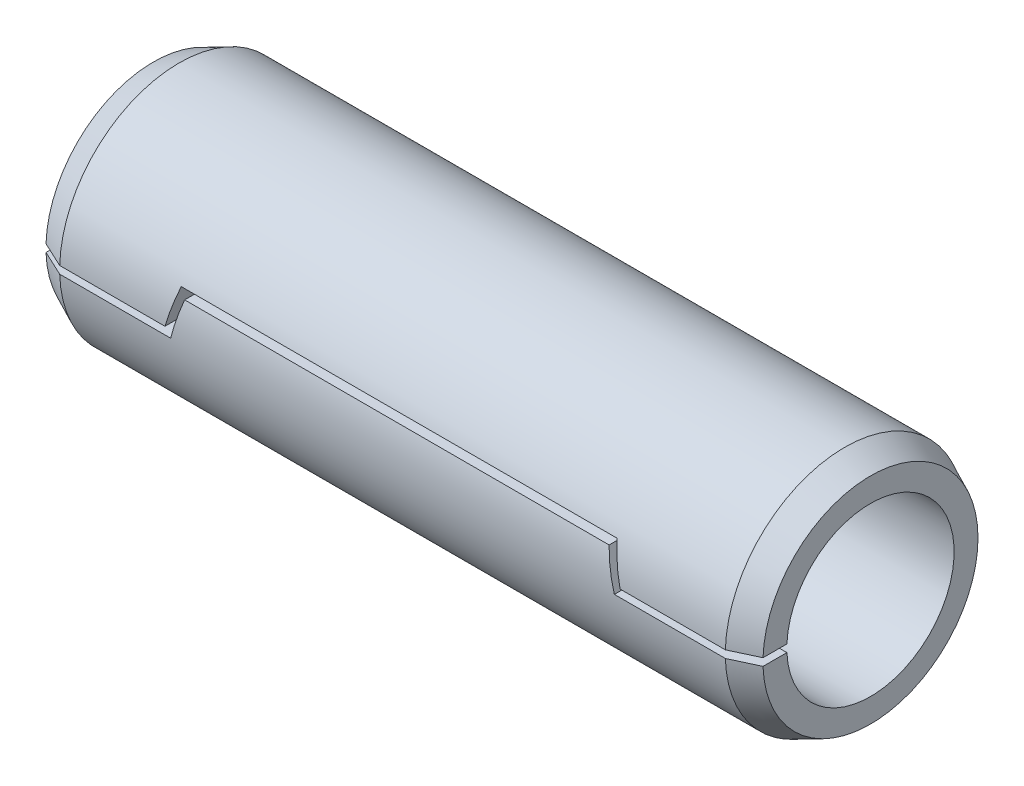
ISO-10303-21;
HEADER;
FILE_DESCRIPTION(('STEP AP214'),'2;1');
FILE_NAME('part.step','',(''),(''),'','','');
FILE_SCHEMA(('AUTOMOTIVE_DESIGN { 1 0 10303 214 1 1 1 1 }'));
ENDSEC;
DATA;
#1=APPLICATION_CONTEXT('core data for automotive mechanical design processes');
#2=APPLICATION_PROTOCOL_DEFINITION('international standard','automotive_design',2000,#1);
#3=PRODUCT_CONTEXT('',#1,'mechanical');
#4=PRODUCT('Part','Part','',(#3));
#5=PRODUCT_RELATED_PRODUCT_CATEGORY('part','',(#4));
#6=PRODUCT_DEFINITION_FORMATION('','',#4);
#7=PRODUCT_DEFINITION_CONTEXT('part definition',#1,'design');
#8=PRODUCT_DEFINITION('design','',#6,#7);
#9=PRODUCT_DEFINITION_SHAPE('','',#8);
#10=(LENGTH_UNIT() NAMED_UNIT(*) SI_UNIT(.MILLI.,.METRE.));
#11=(NAMED_UNIT(*) PLANE_ANGLE_UNIT() SI_UNIT($,.RADIAN.));
#12=(NAMED_UNIT(*) SI_UNIT($,.STERADIAN.) SOLID_ANGLE_UNIT());
#13=UNCERTAINTY_MEASURE_WITH_UNIT(LENGTH_MEASURE(1.E-05),#10,'distance_accuracy_value','');
#14=(GEOMETRIC_REPRESENTATION_CONTEXT(3) GLOBAL_UNCERTAINTY_ASSIGNED_CONTEXT((#13)) GLOBAL_UNIT_ASSIGNED_CONTEXT((#10,
#11,#12)) REPRESENTATION_CONTEXT('',''));
#15=CARTESIAN_POINT('',(0.,0.,0.));
#16=DIRECTION('',(0.,0.,1.));
#17=DIRECTION('',(1.,0.,0.));
#18=AXIS2_PLACEMENT_3D('',#15,#16,#17);
#19=CARTESIAN_POINT('',(-12.,0.,0.));
#20=DIRECTION('',(-1.,0.,0.));
#21=DIRECTION('',(0.,0.,1.));
#22=AXIS2_PLACEMENT_3D('',#19,#20,#21);
#23=CYLINDRICAL_SURFACE('',#22,4.);
#24=CARTESIAN_POINT('',(7.65094855346861,0.,0.));
#25=DIRECTION('',(0.965925826289068,0.258819045102522,0.));
#26=DIRECTION('',(-0.258819045102522,0.965925826289068,0.));
#27=AXIS2_PLACEMENT_3D('',#24,#25,#26);
#28=ELLIPSE('',#27,4.14110472164033,4.);
#29=CARTESIAN_POINT('',(7.29591587349737,1.325,3.77417209464539));
#30=VERTEX_POINT('',#29);
#31=CARTESIAN_POINT('',(7.61745490441472,0.125,3.99804639792987));
#32=VERTEX_POINT('',#31);
#33=EDGE_CURVE('E268',#30,#32,#28,.T.);
#34=ORIENTED_EDGE('',*,*,#33,.T.);
#35=DIRECTION('',(-1.,0.,0.));
#36=VECTOR('',#35,1.);
#37=CARTESIAN_POINT('',(-12.,0.125,3.99804639792987));
#38=LINE('',#37,#36);
#39=CARTESIAN_POINT('',(11.1404816262598,0.125,3.99804639792987));
#40=VERTEX_POINT('',#39);
#41=EDGE_CURVE('E163',#32,#40,#38,.F.);
#42=ORIENTED_EDGE('',*,*,#41,.T.);
#43=CARTESIAN_POINT('',(11.1404816262598,0.,0.));
#44=DIRECTION('',(-1.,0.,0.));
#45=DIRECTION('',(0.,0.,1.));
#46=AXIS2_PLACEMENT_3D('',#43,#44,#45);
#47=CIRCLE('',#46,4.);
#48=CARTESIAN_POINT('',(11.1404816262598,-0.125,3.99804639792987));
#49=VERTEX_POINT('',#48);
#50=EDGE_CURVE('E156',#40,#49,#47,.T.);
#51=ORIENTED_EDGE('',*,*,#50,.T.);
#52=DIRECTION('',(-1.,0.,0.));
#53=VECTOR('',#52,1.);
#54=CARTESIAN_POINT('',(-12.,-0.125,3.99804639792987));
#55=LINE('',#54,#53);
#56=CARTESIAN_POINT('',(7.42562315741998,-0.125,3.99804639792987));
#57=VERTEX_POINT('',#56);
#58=EDGE_CURVE('E146',#57,#49,#55,.F.);
#59=ORIENTED_EDGE('',*,*,#58,.F.);
#60=CARTESIAN_POINT('',(7.39212950836608,0.,0.));
#61=DIRECTION('',(0.965925826289068,0.258819045102522,0.));
#62=DIRECTION('',(-0.258819045102522,0.965925826289068,0.));
#63=AXIS2_PLACEMENT_3D('',#60,#61,#62);
#64=ELLIPSE('',#63,4.14110472164033,4.);
#65=CARTESIAN_POINT('',(7.10408412650263,1.075,3.8528398617124));
#66=VERTEX_POINT('',#65);
#67=EDGE_CURVE('E134',#66,#57,#64,.T.);
#68=ORIENTED_EDGE('',*,*,#67,.F.);
#69=DIRECTION('',(-1.,0.,0.));
#70=VECTOR('',#69,1.);
#71=CARTESIAN_POINT('',(-12.,1.075,3.8528398617124));
#72=LINE('',#71,#70);
#73=CARTESIAN_POINT('',(-7.10408412650263,1.075,3.8528398617124));
#74=VERTEX_POINT('',#73);
#75=EDGE_CURVE('E141',#74,#66,#72,.F.);
#76=ORIENTED_EDGE('',*,*,#75,.F.);
#77=CARTESIAN_POINT('',(-7.39212950836609,0.,0.));
#78=DIRECTION('',(-0.965925826289068,0.258819045102522,0.));
#79=DIRECTION('',(-0.258819045102522,-0.965925826289068,0.));
#80=AXIS2_PLACEMENT_3D('',#77,#78,#79);
#81=ELLIPSE('',#80,4.14110472164033,4.);
#82=CARTESIAN_POINT('',(-7.42562315741998,-0.125,3.99804639792987));
#83=VERTEX_POINT('',#82);
#84=EDGE_CURVE('E225',#83,#74,#81,.T.);
#85=ORIENTED_EDGE('',*,*,#84,.F.);
#86=DIRECTION('',(-1.,0.,0.));
#87=VECTOR('',#86,1.);
#88=CARTESIAN_POINT('',(-12.,-0.125,3.99804639792987));
#89=LINE('',#88,#87);
#90=CARTESIAN_POINT('',(-11.1404816262598,-0.125,3.99804639792987));
#91=VERTEX_POINT('',#90);
#92=EDGE_CURVE('E227',#91,#83,#89,.F.);
#93=ORIENTED_EDGE('',*,*,#92,.F.);
#94=CARTESIAN_POINT('',(-11.1404816262598,0.,0.));
#95=DIRECTION('',(-1.,0.,0.));
#96=DIRECTION('',(0.,0.,1.));
#97=AXIS2_PLACEMENT_3D('',#94,#95,#96);
#98=CIRCLE('',#97,4.);
#99=CARTESIAN_POINT('',(-11.1404816262598,0.125,3.99804639792987));
#100=VERTEX_POINT('',#99);
#101=EDGE_CURVE('E179',#100,#91,#98,.T.);
#102=ORIENTED_EDGE('',*,*,#101,.F.);
#103=DIRECTION('',(-1.,0.,0.));
#104=VECTOR('',#103,1.);
#105=CARTESIAN_POINT('',(-12.,0.125,3.99804639792987));
#106=LINE('',#105,#104);
#107=CARTESIAN_POINT('',(-7.61745490441472,0.125,3.99804639792987));
#108=VERTEX_POINT('',#107);
#109=EDGE_CURVE('E236',#100,#108,#106,.F.);
#110=ORIENTED_EDGE('',*,*,#109,.T.);
#111=CARTESIAN_POINT('',(-7.65094855346861,0.,0.));
#112=DIRECTION('',(-0.965925826289068,0.258819045102522,0.));
#113=DIRECTION('',(-0.258819045102522,-0.965925826289068,0.));
#114=AXIS2_PLACEMENT_3D('',#111,#112,#113);
#115=ELLIPSE('',#114,4.14110472164033,4.);
#116=CARTESIAN_POINT('',(-7.29591587349737,1.325,3.77417209464539));
#117=VERTEX_POINT('',#116);
#118=EDGE_CURVE('E262',#108,#117,#115,.T.);
#119=ORIENTED_EDGE('',*,*,#118,.T.);
#120=DIRECTION('',(-1.,0.,0.));
#121=VECTOR('',#120,1.);
#122=CARTESIAN_POINT('',(-12.,1.325,3.77417209464539));
#123=LINE('',#122,#121);
#124=EDGE_CURVE('E265',#117,#30,#123,.F.);
#125=ORIENTED_EDGE('',*,*,#124,.T.);
#126=EDGE_LOOP('',(#34,#42,#51,#59,#68,#76,#85,#93,#102,#110,#119,#125));
#127=FACE_BOUND('',#126,.T.);
#128=ADVANCED_FACE('F34',(#127),#23,.T.);
#129=CARTESIAN_POINT('',(12.,0.,0.));
#130=DIRECTION('',(-1.,0.,0.));
#131=DIRECTION('',(0.,0.,1.));
#132=AXIS2_PLACEMENT_3D('',#129,#130,#131);
#133=CONICAL_SURFACE('',#132,3.5992,0.436332312998577);
#134=CARTESIAN_POINT('',(6.91106898554045,-0.125,5.97089921780804));
#135=CARTESIAN_POINT('',(7.70661620001014,-0.125,5.5998421672276));
#136=CARTESIAN_POINT('',(8.50216185595303,-0.125,5.22878176890496));
#137=CARTESIAN_POINT('',(10.0932303821678,-0.125,4.48661220727));
#138=CARTESIAN_POINT('',(10.8887532524406,-0.125,4.11550304395961));
#139=CARTESIAN_POINT('',(12.4797566483698,-0.125,3.37319383169209));
#140=CARTESIAN_POINT('',(13.2752371740237,-0.125,3.00199378272961));
#141=CARTESIAN_POINT('',(14.4683698133928,-0.125,2.44500477565653));
#142=CARTESIAN_POINT('',(14.8660660119595,-0.125,2.25931027955035));
#143=CARTESIAN_POINT('',(15.6613837017749,-0.125,1.88776132667536));
#144=CARTESIAN_POINT('',(16.059005193019,-0.125,1.70190686989682));
#145=CARTESIAN_POINT('',(16.4565666476707,-0.125,1.51592395109029));
#146=B_SPLINE_CURVE_WITH_KNOTS('',3,(#134,#135,#136,#137,#138,#139,#140,#141,#142,#143,#144,
#145),.UNSPECIFIED.,.F.,.F.,(4,2,2,2,2,4),(0.,2.63347837848883,5.26695665301675,
7.90043508266569,9.21717436567357,10.5339137288738),.UNSPECIFIED.);
#147=CARTESIAN_POINT('',(12.,-0.125,3.59702872382193));
#148=VERTEX_POINT('',#147);
#149=EDGE_CURVE('E158',#49,#148,#146,.T.);
#150=ORIENTED_EDGE('',*,*,#149,.F.);
#151=ORIENTED_EDGE('',*,*,#50,.F.);
#152=CARTESIAN_POINT('',(6.91106898554045,0.125,5.97089921780804));
#153=CARTESIAN_POINT('',(7.70661620001014,0.125,5.5998421672276));
#154=CARTESIAN_POINT('',(8.50216185595303,0.125,5.22878176890496));
#155=CARTESIAN_POINT('',(10.0932303821678,0.125,4.48661220727));
#156=CARTESIAN_POINT('',(10.8887532524406,0.125,4.11550304395961));
#157=CARTESIAN_POINT('',(12.4797566483698,0.125,3.37319383169209));
#158=CARTESIAN_POINT('',(13.2752371740237,0.125,3.00199378272961));
#159=CARTESIAN_POINT('',(14.4683698133928,0.125,2.44500477565653));
#160=CARTESIAN_POINT('',(14.8660660119595,0.125,2.25931027955035));
#161=CARTESIAN_POINT('',(15.6613837017749,0.125,1.88776132667536));
#162=CARTESIAN_POINT('',(16.059005193019,0.125,1.70190686989682));
#163=CARTESIAN_POINT('',(16.4565666476707,0.125,1.51592395109029));
#164=B_SPLINE_CURVE_WITH_KNOTS('',3,(#152,#153,#154,#155,#156,#157,#158,#159,#160,#161,#162,
#163),.UNSPECIFIED.,.F.,.F.,(4,2,2,2,2,4),(0.,2.63347837848883,5.26695665301675,
7.90043508266569,9.21717436567357,10.5339137288738),.UNSPECIFIED.);
#165=CARTESIAN_POINT('',(12.,0.125,3.59702872382193));
#166=VERTEX_POINT('',#165);
#167=EDGE_CURVE('E270',#40,#166,#164,.T.);
#168=ORIENTED_EDGE('',*,*,#167,.T.);
#169=CARTESIAN_POINT('',(12.,0.,0.));
#170=DIRECTION('',(-1.,0.,0.));
#171=DIRECTION('',(0.,0.,1.));
#172=AXIS2_PLACEMENT_3D('',#169,#170,#171);
#173=CIRCLE('',#172,3.5992);
#174=EDGE_CURVE('E175',#166,#148,#173,.T.);
#175=ORIENTED_EDGE('',*,*,#174,.T.);
#176=EDGE_LOOP('',(#150,#151,#168,#175));
#177=FACE_BOUND('',#176,.T.);
#178=ADVANCED_FACE('F277',(#177),#133,.T.);
#179=CARTESIAN_POINT('',(12.,2.8,0.));
#180=DIRECTION('',(-1.,0.,0.));
#181=DIRECTION('',(0.,0.,1.));
#182=AXIS2_PLACEMENT_3D('',#179,#180,#181);
#183=PLANE('',#182);
#184=DIRECTION('',(0.,0.,-1.));
#185=VECTOR('',#184,1.);
#186=CARTESIAN_POINT('',(12.,-0.125,4.));
#187=LINE('',#186,#185);
#188=CARTESIAN_POINT('',(12.,-0.125,2.79720842984573));
#189=VERTEX_POINT('',#188);
#190=EDGE_CURVE('E142',#148,#189,#187,.T.);
#191=ORIENTED_EDGE('',*,*,#190,.F.);
#192=ORIENTED_EDGE('',*,*,#174,.F.);
#193=DIRECTION('',(0.,0.,-1.));
#194=VECTOR('',#193,1.);
#195=CARTESIAN_POINT('',(12.,0.125,4.));
#196=LINE('',#195,#194);
#197=CARTESIAN_POINT('',(12.,0.125,2.79720842984573));
#198=VERTEX_POINT('',#197);
#199=EDGE_CURVE('E216',#166,#198,#196,.T.);
#200=ORIENTED_EDGE('',*,*,#199,.T.);
#201=CARTESIAN_POINT('',(12.,0.,0.));
#202=DIRECTION('',(-1.,0.,0.));
#203=DIRECTION('',(0.,0.,1.));
#204=AXIS2_PLACEMENT_3D('',#201,#202,#203);
#205=CIRCLE('',#204,2.8);
#206=EDGE_CURVE('E161',#198,#189,#205,.T.);
#207=ORIENTED_EDGE('',*,*,#206,.T.);
#208=EDGE_LOOP('',(#191,#192,#200,#207));
#209=FACE_BOUND('',#208,.T.);
#210=ADVANCED_FACE('F287',(#209),#183,.F.);
#211=CARTESIAN_POINT('',(-12.,3.5992,0.));
#212=DIRECTION('',(1.,0.,0.));
#213=DIRECTION('',(0.,0.,-1.));
#214=AXIS2_PLACEMENT_3D('',#211,#212,#213);
#215=PLANE('',#214);
#216=CARTESIAN_POINT('',(-12.,0.,0.));
#217=DIRECTION('',(-1.,0.,0.));
#218=DIRECTION('',(0.,0.,1.));
#219=AXIS2_PLACEMENT_3D('',#216,#217,#218);
#220=CIRCLE('',#219,2.8);
#221=CARTESIAN_POINT('',(-12.,0.125,2.79720842984573));
#222=VERTEX_POINT('',#221);
#223=CARTESIAN_POINT('',(-12.,-0.125,2.79720842984573));
#224=VERTEX_POINT('',#223);
#225=EDGE_CURVE('E157',#222,#224,#220,.T.);
#226=ORIENTED_EDGE('',*,*,#225,.F.);
#227=DIRECTION('',(0.,0.,-1.));
#228=VECTOR('',#227,1.);
#229=CARTESIAN_POINT('',(-12.,0.125,4.));
#230=LINE('',#229,#228);
#231=CARTESIAN_POINT('',(-12.,0.125,3.59702872382193));
#232=VERTEX_POINT('',#231);
#233=EDGE_CURVE('E57',#232,#222,#230,.T.);
#234=ORIENTED_EDGE('',*,*,#233,.F.);
#235=CARTESIAN_POINT('',(-12.,0.,0.));
#236=DIRECTION('',(-1.,0.,0.));
#237=DIRECTION('',(0.,0.,1.));
#238=AXIS2_PLACEMENT_3D('',#235,#236,#237);
#239=CIRCLE('',#238,3.5992);
#240=CARTESIAN_POINT('',(-12.,-0.125,3.59702872382192));
#241=VERTEX_POINT('',#240);
#242=EDGE_CURVE('E182',#232,#241,#239,.T.);
#243=ORIENTED_EDGE('',*,*,#242,.T.);
#244=DIRECTION('',(0.,0.,-1.));
#245=VECTOR('',#244,1.);
#246=CARTESIAN_POINT('',(-12.,-0.125,4.));
#247=LINE('',#246,#245);
#248=EDGE_CURVE('E416',#241,#224,#247,.T.);
#249=ORIENTED_EDGE('',*,*,#248,.T.);
#250=EDGE_LOOP('',(#226,#234,#243,#249));
#251=FACE_BOUND('',#250,.T.);
#252=ADVANCED_FACE('F36',(#251),#215,.F.);
#253=CARTESIAN_POINT('',(-11.1404816262598,0.,0.));
#254=DIRECTION('',(1.,0.,0.));
#255=DIRECTION('',(0.,0.,-1.));
#256=AXIS2_PLACEMENT_3D('',#253,#254,#255);
#257=CONICAL_SURFACE('',#256,4.,0.436332312998576);
#258=ORIENTED_EDGE('',*,*,#242,.F.);
#259=CARTESIAN_POINT('',(-16.4565666476707,0.125,1.51592395109029));
#260=CARTESIAN_POINT('',(-16.1337465388961,0.125,1.66695075398409));
#261=CARTESIAN_POINT('',(-15.8108830985317,0.125,1.81788485825544));
#262=CARTESIAN_POINT('',(-15.165099845119,0.125,2.11963238108965));
#263=CARTESIAN_POINT('',(-14.8421800320741,0.125,2.27044579965976));
#264=CARTESIAN_POINT('',(-14.0467875287725,0.125,2.64183446538067));
#265=CARTESIAN_POINT('',(-13.5742999437067,0.125,2.86237780501656));
#266=CARTESIAN_POINT('',(-12.6292957829322,0.125,3.30340241742123));
#267=CARTESIAN_POINT('',(-12.1567792072221,0.125,3.52388369018729));
#268=CARTESIAN_POINT('',(-10.8887536247143,0.125,4.11550398483624));
#269=CARTESIAN_POINT('',(-10.0932304861044,0.125,4.48661271605281));
#270=CARTESIAN_POINT('',(-8.50216153281469,0.125,5.22878136237177));
#271=CARTESIAN_POINT('',(-7.70661571813708,0.125,5.59984127747894));
#272=CARTESIAN_POINT('',(-6.91106898554046,0.125,5.97089921780803));
#273=B_SPLINE_CURVE_WITH_KNOTS('',3,(#259,#260,#261,#262,#263,#264,#265,#266,#267,#268,#269,
#270,#271,#272),.UNSPECIFIED.,.F.,.F.,(4,2,2,2,2,2,4),(0.,1.06920397081675,2.13840787744647,
3.70268244750081,5.26695708588959,7.90043554182513,10.5339137389063),.UNSPECIFIED.);
#274=EDGE_CURVE('E255',#232,#100,#273,.T.);
#275=ORIENTED_EDGE('',*,*,#274,.T.);
#276=ORIENTED_EDGE('',*,*,#101,.T.);
#277=CARTESIAN_POINT('',(-16.4565666476707,-0.125,1.51592395109029));
#278=CARTESIAN_POINT('',(-16.1337465388961,-0.125,1.66695075398409));
#279=CARTESIAN_POINT('',(-15.8108830985317,-0.125,1.81788485825544));
#280=CARTESIAN_POINT('',(-15.165099845119,-0.125,2.11963238108965));
#281=CARTESIAN_POINT('',(-14.8421800320741,-0.125,2.27044579965976));
#282=CARTESIAN_POINT('',(-14.0467875287725,-0.125,2.64183446538067));
#283=CARTESIAN_POINT('',(-13.5742999437067,-0.125,2.86237780501656));
#284=CARTESIAN_POINT('',(-12.6292957829322,-0.125,3.30340241742123));
#285=CARTESIAN_POINT('',(-12.1567792072221,-0.125,3.52388369018729));
#286=CARTESIAN_POINT('',(-10.8887536247143,-0.125,4.11550398483624));
#287=CARTESIAN_POINT('',(-10.0932304861044,-0.125,4.48661271605281));
#288=CARTESIAN_POINT('',(-8.50216153281469,-0.125,5.22878136237177));
#289=CARTESIAN_POINT('',(-7.70661571813708,-0.125,5.59984127747894));
#290=CARTESIAN_POINT('',(-6.91106898554046,-0.125,5.97089921780803));
#291=B_SPLINE_CURVE_WITH_KNOTS('',3,(#277,#278,#279,#280,#281,#282,#283,#284,#285,#286,#287,
#288,#289,#290),.UNSPECIFIED.,.F.,.F.,(4,2,2,2,2,2,4),(0.,1.06920397081675,2.13840787744647,
3.70268244750081,5.26695708588959,7.90043554182513,10.5339137389063),.UNSPECIFIED.);
#292=EDGE_CURVE('E229',#241,#91,#291,.T.);
#293=ORIENTED_EDGE('',*,*,#292,.F.);
#294=EDGE_LOOP('',(#258,#275,#276,#293));
#295=FACE_BOUND('',#294,.T.);
#296=ADVANCED_FACE('F238',(#295),#257,.T.);
#297=CARTESIAN_POINT('',(-12.,0.,0.));
#298=DIRECTION('',(-1.,0.,0.));
#299=DIRECTION('',(0.,0.,1.));
#300=AXIS2_PLACEMENT_3D('',#297,#298,#299);
#301=CYLINDRICAL_SURFACE('',#300,2.8);
#302=ORIENTED_EDGE('',*,*,#206,.F.);
#303=DIRECTION('',(-1.,0.,0.));
#304=VECTOR('',#303,1.);
#305=CARTESIAN_POINT('',(-12.,0.125,2.79720842984573));
#306=LINE('',#305,#304);
#307=CARTESIAN_POINT('',(7.61745490441472,0.125,2.79720842984573));
#308=VERTEX_POINT('',#307);
#309=EDGE_CURVE('E11',#198,#308,#306,.T.);
#310=ORIENTED_EDGE('',*,*,#309,.T.);
#311=CARTESIAN_POINT('',(7.65094855346861,0.,0.));
#312=DIRECTION('',(0.965925826289068,0.258819045102522,0.));
#313=DIRECTION('',(-0.258819045102522,0.965925826289068,0.));
#314=AXIS2_PLACEMENT_3D('',#311,#312,#313);
#315=ELLIPSE('',#314,2.89877330514823,2.8);
#316=CARTESIAN_POINT('',(7.29591587349737,1.325,2.46665259004992));
#317=VERTEX_POINT('',#316);
#318=EDGE_CURVE('E42',#308,#317,#315,.F.);
#319=ORIENTED_EDGE('',*,*,#318,.T.);
#320=DIRECTION('',(-1.,0.,0.));
#321=VECTOR('',#320,1.);
#322=CARTESIAN_POINT('',(-12.,1.325,2.46665259004992));
#323=LINE('',#322,#321);
#324=CARTESIAN_POINT('',(-7.29591587349737,1.325,2.46665259004992));
#325=VERTEX_POINT('',#324);
#326=EDGE_CURVE('E199',#317,#325,#323,.T.);
#327=ORIENTED_EDGE('',*,*,#326,.T.);
#328=CARTESIAN_POINT('',(-7.65094855346861,0.,0.));
#329=DIRECTION('',(-0.965925826289068,0.258819045102522,0.));
#330=DIRECTION('',(-0.258819045102522,-0.965925826289068,0.));
#331=AXIS2_PLACEMENT_3D('',#328,#329,#330);
#332=ELLIPSE('',#331,2.89877330514823,2.8);
#333=CARTESIAN_POINT('',(-7.61745490441472,0.125,2.79720842984573));
#334=VERTEX_POINT('',#333);
#335=EDGE_CURVE('E196',#325,#334,#332,.F.);
#336=ORIENTED_EDGE('',*,*,#335,.T.);
#337=DIRECTION('',(-1.,0.,0.));
#338=VECTOR('',#337,1.);
#339=CARTESIAN_POINT('',(-12.,0.125,2.79720842984573));
#340=LINE('',#339,#338);
#341=EDGE_CURVE('E194',#334,#222,#340,.T.);
#342=ORIENTED_EDGE('',*,*,#341,.T.);
#343=ORIENTED_EDGE('',*,*,#225,.T.);
#344=DIRECTION('',(-1.,0.,0.));
#345=VECTOR('',#344,1.);
#346=CARTESIAN_POINT('',(-12.,-0.125,2.79720842984573));
#347=LINE('',#346,#345);
#348=CARTESIAN_POINT('',(-7.42562315741998,-0.125,2.79720842984573));
#349=VERTEX_POINT('',#348);
#350=EDGE_CURVE('E191',#349,#224,#347,.T.);
#351=ORIENTED_EDGE('',*,*,#350,.F.);
#352=CARTESIAN_POINT('',(-7.39212950836609,0.,0.));
#353=DIRECTION('',(-0.965925826289068,0.258819045102522,0.));
#354=DIRECTION('',(-0.258819045102522,-0.965925826289068,0.));
#355=AXIS2_PLACEMENT_3D('',#352,#353,#354);
#356=ELLIPSE('',#355,2.89877330514823,2.8);
#357=CARTESIAN_POINT('',(-7.10408412650263,1.075,2.58541582728968));
#358=VERTEX_POINT('',#357);
#359=EDGE_CURVE('E189',#358,#349,#356,.F.);
#360=ORIENTED_EDGE('',*,*,#359,.F.);
#361=DIRECTION('',(-1.,0.,0.));
#362=VECTOR('',#361,1.);
#363=CARTESIAN_POINT('',(-12.,1.075,2.58541582728968));
#364=LINE('',#363,#362);
#365=CARTESIAN_POINT('',(7.10408412650263,1.075,2.58541582728968));
#366=VERTEX_POINT('',#365);
#367=EDGE_CURVE('E187',#366,#358,#364,.T.);
#368=ORIENTED_EDGE('',*,*,#367,.F.);
#369=CARTESIAN_POINT('',(7.39212950836608,0.,0.));
#370=DIRECTION('',(0.965925826289068,0.258819045102522,0.));
#371=DIRECTION('',(-0.258819045102522,0.965925826289068,0.));
#372=AXIS2_PLACEMENT_3D('',#369,#370,#371);
#373=ELLIPSE('',#372,2.89877330514823,2.8);
#374=CARTESIAN_POINT('',(7.42562315741998,-0.125,2.79720842984573));
#375=VERTEX_POINT('',#374);
#376=EDGE_CURVE('E185',#375,#366,#373,.F.);
#377=ORIENTED_EDGE('',*,*,#376,.F.);
#378=DIRECTION('',(-1.,0.,0.));
#379=VECTOR('',#378,1.);
#380=CARTESIAN_POINT('',(-12.,-0.125,2.79720842984573));
#381=LINE('',#380,#379);
#382=EDGE_CURVE('E149',#189,#375,#381,.T.);
#383=ORIENTED_EDGE('',*,*,#382,.F.);
#384=EDGE_LOOP('',(#302,#310,#319,#327,#336,#342,#343,#351,#360,#368,#377,#383));
#385=FACE_BOUND('',#384,.T.);
#386=ADVANCED_FACE('F204',(#385),#301,.F.);
#387=CARTESIAN_POINT('',(7.07925927171387,1.16764761936218,4.));
#388=DIRECTION('',(0.965925826289068,0.258819045102522,0.));
#389=DIRECTION('',(-0.258819045102522,0.965925826289068,0.));
#390=AXIS2_PLACEMENT_3D('',#387,#388,#389);
#391=PLANE('',#390);
#392=ORIENTED_EDGE('',*,*,#67,.T.);
#393=DIRECTION('',(0.,0.,-1.));
#394=VECTOR('',#393,1.);
#395=CARTESIAN_POINT('',(7.42562315741998,-0.125,4.));
#396=LINE('',#395,#394);
#397=EDGE_CURVE('E49',#57,#375,#396,.T.);
#398=ORIENTED_EDGE('',*,*,#397,.T.);
#399=ORIENTED_EDGE('',*,*,#376,.T.);
#400=DIRECTION('',(0.,0.,-1.));
#401=VECTOR('',#400,1.);
#402=CARTESIAN_POINT('',(7.10408412650263,1.075,4.));
#403=LINE('',#402,#401);
#404=EDGE_CURVE('E137',#66,#366,#403,.T.);
#405=ORIENTED_EDGE('',*,*,#404,.F.);
#406=EDGE_LOOP('',(#392,#398,#399,#405));
#407=FACE_BOUND('',#406,.T.);
#408=ADVANCED_FACE('F135',(#407),#391,.T.);
#409=CARTESIAN_POINT('',(-7.2,1.075,4.));
#410=DIRECTION('',(0.,1.,0.));
#411=DIRECTION('',(0.,0.,1.));
#412=AXIS2_PLACEMENT_3D('',#409,#410,#411);
#413=PLANE('',#412);
#414=ORIENTED_EDGE('',*,*,#75,.T.);
#415=ORIENTED_EDGE('',*,*,#404,.T.);
#416=ORIENTED_EDGE('',*,*,#367,.T.);
#417=DIRECTION('',(0.,0.,-1.));
#418=VECTOR('',#417,1.);
#419=CARTESIAN_POINT('',(-7.10408412650263,1.075,4.));
#420=LINE('',#419,#418);
#421=EDGE_CURVE('E422',#74,#358,#420,.T.);
#422=ORIENTED_EDGE('',*,*,#421,.F.);
#423=EDGE_LOOP('',(#414,#415,#416,#422));
#424=FACE_BOUND('',#423,.T.);
#425=ADVANCED_FACE('F337',(#424),#413,.T.);
#426=CARTESIAN_POINT('',(-7.40079830263121,-0.0323523806378152,4.));
#427=DIRECTION('',(-0.965925826289068,0.258819045102522,0.));
#428=DIRECTION('',(-0.258819045102522,-0.965925826289068,0.));
#429=AXIS2_PLACEMENT_3D('',#426,#427,#428);
#430=PLANE('',#429);
#431=ORIENTED_EDGE('',*,*,#84,.T.);
#432=ORIENTED_EDGE('',*,*,#421,.T.);
#433=ORIENTED_EDGE('',*,*,#359,.T.);
#434=DIRECTION('',(0.,0.,-1.));
#435=VECTOR('',#434,1.);
#436=CARTESIAN_POINT('',(-7.42562315741998,-0.125,4.));
#437=LINE('',#436,#435);
#438=EDGE_CURVE('E418',#83,#349,#437,.T.);
#439=ORIENTED_EDGE('',*,*,#438,.F.);
#440=EDGE_LOOP('',(#431,#432,#433,#439));
#441=FACE_BOUND('',#440,.T.);
#442=ADVANCED_FACE('F246',(#441),#430,.T.);
#443=CARTESIAN_POINT('',(-12.,-0.125,4.));
#444=DIRECTION('',(0.,1.,0.));
#445=DIRECTION('',(0.,0.,1.));
#446=AXIS2_PLACEMENT_3D('',#443,#444,#445);
#447=PLANE('',#446);
#448=ORIENTED_EDGE('',*,*,#292,.T.);
#449=ORIENTED_EDGE('',*,*,#92,.T.);
#450=ORIENTED_EDGE('',*,*,#438,.T.);
#451=ORIENTED_EDGE('',*,*,#350,.T.);
#452=ORIENTED_EDGE('',*,*,#248,.F.);
#453=EDGE_LOOP('',(#448,#449,#450,#451,#452));
#454=FACE_BOUND('',#453,.T.);
#455=ADVANCED_FACE('F241',(#454),#447,.T.);
#456=CARTESIAN_POINT('',(7.52153903091735,-0.125,4.));
#457=DIRECTION('',(0.,1.,0.));
#458=DIRECTION('',(0.,0.,1.));
#459=AXIS2_PLACEMENT_3D('',#456,#457,#458);
#460=PLANE('',#459);
#461=ORIENTED_EDGE('',*,*,#58,.T.);
#462=ORIENTED_EDGE('',*,*,#149,.T.);
#463=ORIENTED_EDGE('',*,*,#190,.T.);
#464=ORIENTED_EDGE('',*,*,#382,.T.);
#465=ORIENTED_EDGE('',*,*,#397,.F.);
#466=EDGE_LOOP('',(#461,#462,#463,#464,#465));
#467=FACE_BOUND('',#466,.T.);
#468=ADVANCED_FACE('F145',(#467),#460,.T.);
#469=CARTESIAN_POINT('',(7.52153903091735,0.125,4.));
#470=DIRECTION('',(0.,1.,0.));
#471=DIRECTION('',(0.,0.,1.));
#472=AXIS2_PLACEMENT_3D('',#469,#470,#471);
#473=PLANE('',#472);
#474=DIRECTION('',(0.,0.,-1.));
#475=VECTOR('',#474,1.);
#476=CARTESIAN_POINT('',(7.61745490441472,0.125,4.));
#477=LINE('',#476,#475);
#478=EDGE_CURVE('E210',#32,#308,#477,.T.);
#479=ORIENTED_EDGE('',*,*,#478,.T.);
#480=ORIENTED_EDGE('',*,*,#309,.F.);
#481=ORIENTED_EDGE('',*,*,#199,.F.);
#482=ORIENTED_EDGE('',*,*,#167,.F.);
#483=ORIENTED_EDGE('',*,*,#41,.F.);
#484=EDGE_LOOP('',(#479,#480,#481,#482,#483));
#485=FACE_BOUND('',#484,.T.);
#486=ADVANCED_FACE('F214',(#485),#473,.F.);
#487=CARTESIAN_POINT('',(7.32074072828613,1.23235238063781,4.));
#488=DIRECTION('',(0.965925826289068,0.258819045102522,0.));
#489=DIRECTION('',(-0.258819045102522,0.965925826289068,0.));
#490=AXIS2_PLACEMENT_3D('',#487,#488,#489);
#491=PLANE('',#490);
#492=DIRECTION('',(0.,0.,-1.));
#493=VECTOR('',#492,1.);
#494=CARTESIAN_POINT('',(7.29591587349737,1.325,4.));
#495=LINE('',#494,#493);
#496=EDGE_CURVE('E212',#30,#317,#495,.T.);
#497=ORIENTED_EDGE('',*,*,#496,.T.);
#498=ORIENTED_EDGE('',*,*,#318,.F.);
#499=ORIENTED_EDGE('',*,*,#478,.F.);
#500=ORIENTED_EDGE('',*,*,#33,.F.);
#501=EDGE_LOOP('',(#497,#498,#499,#500));
#502=FACE_BOUND('',#501,.T.);
#503=ADVANCED_FACE('F209',(#502),#491,.F.);
#504=CARTESIAN_POINT('',(-7.2,1.325,4.));
#505=DIRECTION('',(0.,1.,0.));
#506=DIRECTION('',(0.,0.,1.));
#507=AXIS2_PLACEMENT_3D('',#504,#505,#506);
#508=PLANE('',#507);
#509=DIRECTION('',(0.,0.,-1.));
#510=VECTOR('',#509,1.);
#511=CARTESIAN_POINT('',(-7.29591587349737,1.325,4.));
#512=LINE('',#511,#510);
#513=EDGE_CURVE('E219',#117,#325,#512,.T.);
#514=ORIENTED_EDGE('',*,*,#513,.T.);
#515=ORIENTED_EDGE('',*,*,#326,.F.);
#516=ORIENTED_EDGE('',*,*,#496,.F.);
#517=ORIENTED_EDGE('',*,*,#124,.F.);
#518=EDGE_LOOP('',(#514,#515,#516,#517));
#519=FACE_BOUND('',#518,.T.);
#520=ADVANCED_FACE('F380',(#519),#508,.F.);
#521=CARTESIAN_POINT('',(-7.64227975920348,0.0323523806378152,4.));
#522=DIRECTION('',(-0.965925826289068,0.258819045102522,0.));
#523=DIRECTION('',(-0.258819045102522,-0.965925826289068,0.));
#524=AXIS2_PLACEMENT_3D('',#521,#522,#523);
#525=PLANE('',#524);
#526=DIRECTION('',(0.,0.,-1.));
#527=VECTOR('',#526,1.);
#528=CARTESIAN_POINT('',(-7.61745490441472,0.125,4.));
#529=LINE('',#528,#527);
#530=EDGE_CURVE('E407',#108,#334,#529,.T.);
#531=ORIENTED_EDGE('',*,*,#530,.T.);
#532=ORIENTED_EDGE('',*,*,#335,.F.);
#533=ORIENTED_EDGE('',*,*,#513,.F.);
#534=ORIENTED_EDGE('',*,*,#118,.F.);
#535=EDGE_LOOP('',(#531,#532,#533,#534));
#536=FACE_BOUND('',#535,.T.);
#537=ADVANCED_FACE('F253',(#536),#525,.F.);
#538=CARTESIAN_POINT('',(-12.,0.125,4.));
#539=DIRECTION('',(0.,1.,0.));
#540=DIRECTION('',(0.,0.,1.));
#541=AXIS2_PLACEMENT_3D('',#538,#539,#540);
#542=PLANE('',#541);
#543=ORIENTED_EDGE('',*,*,#233,.T.);
#544=ORIENTED_EDGE('',*,*,#341,.F.);
#545=ORIENTED_EDGE('',*,*,#530,.F.);
#546=ORIENTED_EDGE('',*,*,#109,.F.);
#547=ORIENTED_EDGE('',*,*,#274,.F.);
#548=EDGE_LOOP('',(#543,#544,#545,#546,#547));
#549=FACE_BOUND('',#548,.T.);
#550=ADVANCED_FACE('F249',(#549),#542,.F.);
#551=CLOSED_SHELL('',(#128,#178,#210,#252,#296,#386,#408,#425,#442,#455,#468,#486,#503,#520,
#537,#550));
#552=MANIFOLD_SOLID_BREP('B2',#551);
#553=ADVANCED_BREP_SHAPE_REPRESENTATION('',(#18,#552),#14);
#554=SHAPE_DEFINITION_REPRESENTATION(#9,#553);
ENDSEC;
END-ISO-10303-21;
